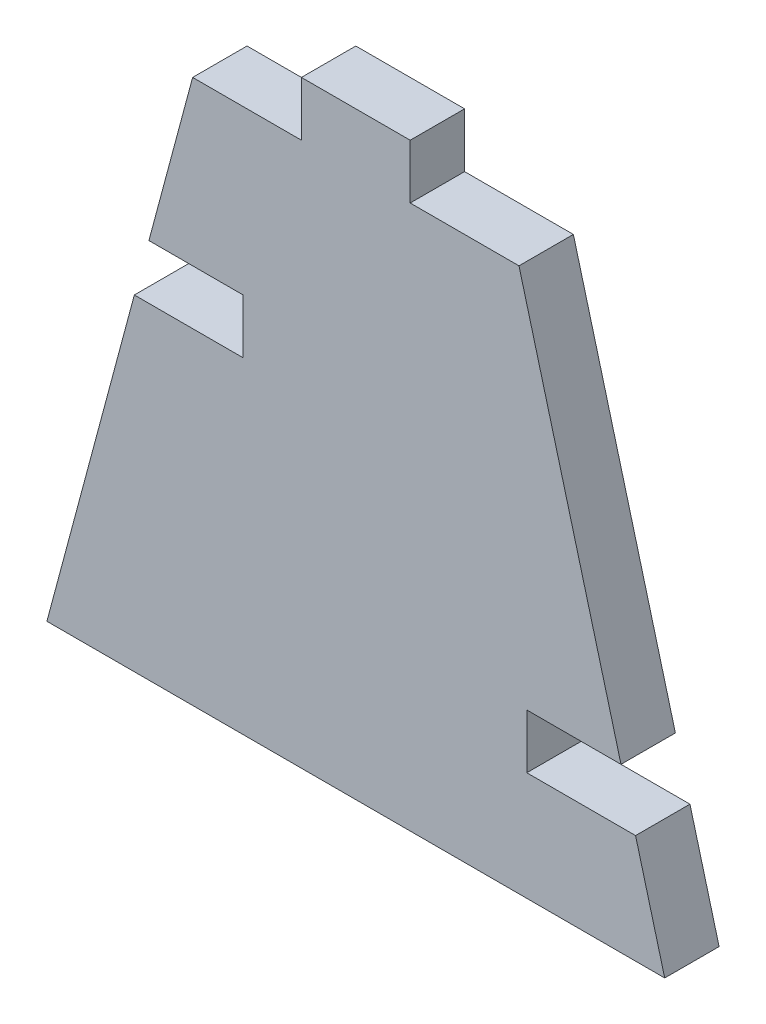
ISO-10303-21;
HEADER;
FILE_DESCRIPTION(('STEP AP214'),'2;1');
FILE_NAME('part.step','',(''),(''),'','','');
FILE_SCHEMA(('AUTOMOTIVE_DESIGN { 1 0 10303 214 1 1 1 1 }'));
ENDSEC;
DATA;
#1=APPLICATION_CONTEXT('core data for automotive mechanical design processes');
#2=APPLICATION_PROTOCOL_DEFINITION('international standard','automotive_design',2000,#1);
#3=PRODUCT_CONTEXT('',#1,'mechanical');
#4=PRODUCT('Part','Part','',(#3));
#5=PRODUCT_RELATED_PRODUCT_CATEGORY('part','',(#4));
#6=PRODUCT_DEFINITION_FORMATION('','',#4);
#7=PRODUCT_DEFINITION_CONTEXT('part definition',#1,'design');
#8=PRODUCT_DEFINITION('design','',#6,#7);
#9=PRODUCT_DEFINITION_SHAPE('','',#8);
#10=(LENGTH_UNIT() NAMED_UNIT(*) SI_UNIT(.MILLI.,.METRE.));
#11=(NAMED_UNIT(*) PLANE_ANGLE_UNIT() SI_UNIT($,.RADIAN.));
#12=(NAMED_UNIT(*) SI_UNIT($,.STERADIAN.) SOLID_ANGLE_UNIT());
#13=UNCERTAINTY_MEASURE_WITH_UNIT(LENGTH_MEASURE(1.E-05),#10,'distance_accuracy_value','');
#14=(GEOMETRIC_REPRESENTATION_CONTEXT(3) GLOBAL_UNCERTAINTY_ASSIGNED_CONTEXT((#13)) GLOBAL_UNIT_ASSIGNED_CONTEXT((#10,
#11,#12)) REPRESENTATION_CONTEXT('',''));
#15=CARTESIAN_POINT('',(0.,0.,0.));
#16=DIRECTION('',(0.,0.,1.));
#17=DIRECTION('',(1.,0.,0.));
#18=AXIS2_PLACEMENT_3D('',#15,#16,#17);
#19=CARTESIAN_POINT('',(-8.03847577293381,-30.,10.));
#20=DIRECTION('',(0.965925826289067,-0.258819045102525,0.));
#21=DIRECTION('',(0.258819045102525,0.965925826289067,0.));
#22=AXIS2_PLACEMENT_3D('',#19,#20,#21);
#23=PLANE('',#22);
#24=DIRECTION('',(-0.258819045102525,-0.965925826289067,0.));
#25=VECTOR('',#24,1.);
#26=CARTESIAN_POINT('',(-8.03847577293381,-30.,0.));
#27=LINE('',#26,#25);
#28=CARTESIAN_POINT('',(0.,0.,0.));
#29=VERTEX_POINT('',#28);
#30=CARTESIAN_POINT('',(-8.03847577293381,-30.,0.));
#31=VERTEX_POINT('',#30);
#32=EDGE_CURVE('E188',#29,#31,#27,.T.);
#33=ORIENTED_EDGE('',*,*,#32,.T.);
#34=DIRECTION('',(0.,0.,-1.));
#35=VECTOR('',#34,1.);
#36=CARTESIAN_POINT('',(-8.03847577293381,-30.,10.));
#37=LINE('',#36,#35);
#38=CARTESIAN_POINT('',(-8.03847577293381,-30.,10.));
#39=VERTEX_POINT('',#38);
#40=EDGE_CURVE('E11',#39,#31,#37,.T.);
#41=ORIENTED_EDGE('',*,*,#40,.F.);
#42=DIRECTION('',(-0.258819045102525,-0.965925826289067,0.));
#43=VECTOR('',#42,1.);
#44=CARTESIAN_POINT('',(-8.03847577293381,-30.,10.));
#45=LINE('',#44,#43);
#46=CARTESIAN_POINT('',(0.,0.,10.));
#47=VERTEX_POINT('',#46);
#48=EDGE_CURVE('E234',#47,#39,#45,.T.);
#49=ORIENTED_EDGE('',*,*,#48,.F.);
#50=DIRECTION('',(0.,0.,-1.));
#51=VECTOR('',#50,1.);
#52=CARTESIAN_POINT('',(0.,0.,10.));
#53=LINE('',#52,#51);
#54=EDGE_CURVE('E184',#47,#29,#53,.T.);
#55=ORIENTED_EDGE('',*,*,#54,.T.);
#56=EDGE_LOOP('',(#33,#41,#49,#55));
#57=FACE_BOUND('',#56,.T.);
#58=ADVANCED_FACE('F39',(#57),#23,.F.);
#59=CARTESIAN_POINT('',(9.28203230275491,-30.,10.));
#60=DIRECTION('',(0.,1.,0.));
#61=DIRECTION('',(-1.,0.,0.));
#62=AXIS2_PLACEMENT_3D('',#59,#60,#61);
#63=PLANE('',#62);
#64=DIRECTION('',(1.,0.,0.));
#65=VECTOR('',#64,1.);
#66=CARTESIAN_POINT('',(9.28203230275491,-30.,0.));
#67=LINE('',#66,#65);
#68=CARTESIAN_POINT('',(9.28203230275491,-30.,0.));
#69=VERTEX_POINT('',#68);
#70=EDGE_CURVE('E192',#31,#69,#67,.T.);
#71=ORIENTED_EDGE('',*,*,#70,.T.);
#72=DIRECTION('',(0.,0.,-1.));
#73=VECTOR('',#72,1.);
#74=CARTESIAN_POINT('',(9.28203230275491,-30.,10.));
#75=LINE('',#74,#73);
#76=CARTESIAN_POINT('',(9.28203230275491,-30.,10.));
#77=VERTEX_POINT('',#76);
#78=EDGE_CURVE('E48',#77,#69,#75,.T.);
#79=ORIENTED_EDGE('',*,*,#78,.F.);
#80=DIRECTION('',(1.,0.,0.));
#81=VECTOR('',#80,1.);
#82=CARTESIAN_POINT('',(9.28203230275491,-30.,10.));
#83=LINE('',#82,#81);
#84=EDGE_CURVE('E123',#39,#77,#83,.T.);
#85=ORIENTED_EDGE('',*,*,#84,.F.);
#86=ORIENTED_EDGE('',*,*,#40,.T.);
#87=EDGE_LOOP('',(#71,#79,#85,#86));
#88=FACE_BOUND('',#87,.T.);
#89=ADVANCED_FACE('F356',(#88),#63,.F.);
#90=CARTESIAN_POINT('',(9.28203230275491,-40.,10.));
#91=DIRECTION('',(1.,0.,0.));
#92=DIRECTION('',(0.,0.,-1.));
#93=AXIS2_PLACEMENT_3D('',#90,#91,#92);
#94=PLANE('',#93);
#95=DIRECTION('',(0.,-1.,0.));
#96=VECTOR('',#95,1.);
#97=CARTESIAN_POINT('',(9.28203230275491,-40.,0.));
#98=LINE('',#97,#96);
#99=CARTESIAN_POINT('',(9.28203230275491,-40.,0.));
#100=VERTEX_POINT('',#99);
#101=EDGE_CURVE('E195',#69,#100,#98,.T.);
#102=ORIENTED_EDGE('',*,*,#101,.T.);
#103=DIRECTION('',(0.,0.,-1.));
#104=VECTOR('',#103,1.);
#105=CARTESIAN_POINT('',(9.28203230275491,-40.,10.));
#106=LINE('',#105,#104);
#107=CARTESIAN_POINT('',(9.28203230275491,-40.,10.));
#108=VERTEX_POINT('',#107);
#109=EDGE_CURVE('E277',#108,#100,#106,.T.);
#110=ORIENTED_EDGE('',*,*,#109,.F.);
#111=DIRECTION('',(0.,-1.,0.));
#112=VECTOR('',#111,1.);
#113=CARTESIAN_POINT('',(9.28203230275491,-40.,10.));
#114=LINE('',#113,#112);
#115=EDGE_CURVE('E287',#77,#108,#114,.T.);
#116=ORIENTED_EDGE('',*,*,#115,.F.);
#117=ORIENTED_EDGE('',*,*,#78,.T.);
#118=EDGE_LOOP('',(#102,#110,#116,#117));
#119=FACE_BOUND('',#118,.T.);
#120=ADVANCED_FACE('F285',(#119),#94,.F.);
#121=CARTESIAN_POINT('',(-10.7179676972451,-40.,10.));
#122=DIRECTION('',(0.,-1.,0.));
#123=DIRECTION('',(0.,0.,-1.));
#124=AXIS2_PLACEMENT_3D('',#121,#122,#123);
#125=PLANE('',#124);
#126=DIRECTION('',(-1.,0.,0.));
#127=VECTOR('',#126,1.);
#128=CARTESIAN_POINT('',(-10.7179676972451,-40.,0.));
#129=LINE('',#128,#127);
#130=CARTESIAN_POINT('',(-10.7179676972451,-40.,0.));
#131=VERTEX_POINT('',#130);
#132=EDGE_CURVE('E198',#100,#131,#129,.T.);
#133=ORIENTED_EDGE('',*,*,#132,.T.);
#134=DIRECTION('',(0.,0.,-1.));
#135=VECTOR('',#134,1.);
#136=CARTESIAN_POINT('',(-10.7179676972451,-40.,10.));
#137=LINE('',#136,#135);
#138=CARTESIAN_POINT('',(-10.7179676972451,-40.,10.));
#139=VERTEX_POINT('',#138);
#140=EDGE_CURVE('E273',#139,#131,#137,.T.);
#141=ORIENTED_EDGE('',*,*,#140,.F.);
#142=DIRECTION('',(-1.,0.,0.));
#143=VECTOR('',#142,1.);
#144=CARTESIAN_POINT('',(-10.7179676972451,-40.,10.));
#145=LINE('',#144,#143);
#146=EDGE_CURVE('E306',#108,#139,#145,.T.);
#147=ORIENTED_EDGE('',*,*,#146,.F.);
#148=ORIENTED_EDGE('',*,*,#109,.T.);
#149=EDGE_LOOP('',(#133,#141,#147,#148));
#150=FACE_BOUND('',#149,.T.);
#151=ADVANCED_FACE('F296',(#150),#125,.F.);
#152=CARTESIAN_POINT('',(-26.7949192431127,-100.,10.));
#153=DIRECTION('',(0.965925826289067,-0.258819045102525,0.));
#154=DIRECTION('',(0.258819045102525,0.965925826289067,0.));
#155=AXIS2_PLACEMENT_3D('',#152,#153,#154);
#156=PLANE('',#155);
#157=DIRECTION('',(-0.258819045102525,-0.965925826289067,0.));
#158=VECTOR('',#157,1.);
#159=CARTESIAN_POINT('',(-26.7949192431127,-100.,0.));
#160=LINE('',#159,#158);
#161=CARTESIAN_POINT('',(-26.7949192431127,-100.,0.));
#162=VERTEX_POINT('',#161);
#163=EDGE_CURVE('E201',#131,#162,#160,.T.);
#164=ORIENTED_EDGE('',*,*,#163,.T.);
#165=DIRECTION('',(0.,0.,-1.));
#166=VECTOR('',#165,1.);
#167=CARTESIAN_POINT('',(-26.7949192431127,-100.,10.));
#168=LINE('',#167,#166);
#169=CARTESIAN_POINT('',(-26.7949192431127,-100.,10.));
#170=VERTEX_POINT('',#169);
#171=EDGE_CURVE('E269',#170,#162,#168,.T.);
#172=ORIENTED_EDGE('',*,*,#171,.F.);
#173=DIRECTION('',(-0.258819045102525,-0.965925826289067,0.));
#174=VECTOR('',#173,1.);
#175=CARTESIAN_POINT('',(-26.7949192431127,-100.,10.));
#176=LINE('',#175,#174);
#177=EDGE_CURVE('E302',#139,#170,#176,.T.);
#178=ORIENTED_EDGE('',*,*,#177,.F.);
#179=ORIENTED_EDGE('',*,*,#140,.T.);
#180=EDGE_LOOP('',(#164,#172,#178,#179));
#181=FACE_BOUND('',#180,.T.);
#182=ADVANCED_FACE('F300',(#181),#156,.F.);
#183=CARTESIAN_POINT('',(86.7949192431127,-100.,10.));
#184=DIRECTION('',(0.,1.,0.));
#185=DIRECTION('',(-1.,0.,0.));
#186=AXIS2_PLACEMENT_3D('',#183,#184,#185);
#187=PLANE('',#186);
#188=DIRECTION('',(1.,0.,0.));
#189=VECTOR('',#188,1.);
#190=CARTESIAN_POINT('',(86.7949192431127,-100.,0.));
#191=LINE('',#190,#189);
#192=CARTESIAN_POINT('',(86.7949192431127,-100.,0.));
#193=VERTEX_POINT('',#192);
#194=EDGE_CURVE('E204',#162,#193,#191,.T.);
#195=ORIENTED_EDGE('',*,*,#194,.T.);
#196=DIRECTION('',(0.,0.,-1.));
#197=VECTOR('',#196,1.);
#198=CARTESIAN_POINT('',(86.7949192431127,-100.,10.));
#199=LINE('',#198,#197);
#200=CARTESIAN_POINT('',(86.7949192431127,-100.,10.));
#201=VERTEX_POINT('',#200);
#202=EDGE_CURVE('E265',#201,#193,#199,.T.);
#203=ORIENTED_EDGE('',*,*,#202,.F.);
#204=DIRECTION('',(1.,0.,0.));
#205=VECTOR('',#204,1.);
#206=CARTESIAN_POINT('',(86.7949192431127,-100.,10.));
#207=LINE('',#206,#205);
#208=EDGE_CURVE('E305',#170,#201,#207,.T.);
#209=ORIENTED_EDGE('',*,*,#208,.F.);
#210=ORIENTED_EDGE('',*,*,#171,.T.);
#211=EDGE_LOOP('',(#195,#203,#209,#210));
#212=FACE_BOUND('',#211,.T.);
#213=ADVANCED_FACE('F369',(#212),#187,.F.);
#214=CARTESIAN_POINT('',(81.4359353944902,-80.,10.));
#215=DIRECTION('',(-0.965925826289067,-0.258819045102525,0.));
#216=DIRECTION('',(0.258819045102525,-0.965925826289067,0.));
#217=AXIS2_PLACEMENT_3D('',#214,#215,#216);
#218=PLANE('',#217);
#219=DIRECTION('',(-0.258819045102525,0.965925826289067,0.));
#220=VECTOR('',#219,1.);
#221=CARTESIAN_POINT('',(81.4359353944902,-80.,0.));
#222=LINE('',#221,#220);
#223=CARTESIAN_POINT('',(81.4359353944902,-80.,0.));
#224=VERTEX_POINT('',#223);
#225=EDGE_CURVE('E207',#193,#224,#222,.T.);
#226=ORIENTED_EDGE('',*,*,#225,.T.);
#227=DIRECTION('',(0.,0.,-1.));
#228=VECTOR('',#227,1.);
#229=CARTESIAN_POINT('',(81.4359353944902,-80.,10.));
#230=LINE('',#229,#228);
#231=CARTESIAN_POINT('',(81.4359353944902,-80.,10.));
#232=VERTEX_POINT('',#231);
#233=EDGE_CURVE('E261',#232,#224,#230,.T.);
#234=ORIENTED_EDGE('',*,*,#233,.F.);
#235=DIRECTION('',(-0.258819045102525,0.965925826289067,0.));
#236=VECTOR('',#235,1.);
#237=CARTESIAN_POINT('',(81.4359353944902,-80.,10.));
#238=LINE('',#237,#236);
#239=EDGE_CURVE('E310',#201,#232,#238,.T.);
#240=ORIENTED_EDGE('',*,*,#239,.F.);
#241=ORIENTED_EDGE('',*,*,#202,.T.);
#242=EDGE_LOOP('',(#226,#234,#240,#241));
#243=FACE_BOUND('',#242,.T.);
#244=ADVANCED_FACE('F372',(#243),#218,.F.);
#245=CARTESIAN_POINT('',(81.4359353944902,-80.,10.));
#246=DIRECTION('',(0.,-1.,0.));
#247=DIRECTION('',(0.,0.,-1.));
#248=AXIS2_PLACEMENT_3D('',#245,#246,#247);
#249=PLANE('',#248);
#250=DIRECTION('',(-1.,0.,0.));
#251=VECTOR('',#250,1.);
#252=CARTESIAN_POINT('',(81.4359353944902,-80.,0.));
#253=LINE('',#252,#251);
#254=CARTESIAN_POINT('',(61.4359353944902,-80.,0.));
#255=VERTEX_POINT('',#254);
#256=EDGE_CURVE('E210',#224,#255,#253,.T.);
#257=ORIENTED_EDGE('',*,*,#256,.T.);
#258=DIRECTION('',(0.,0.,-1.));
#259=VECTOR('',#258,1.);
#260=CARTESIAN_POINT('',(61.4359353944902,-80.,10.));
#261=LINE('',#260,#259);
#262=CARTESIAN_POINT('',(61.4359353944902,-80.,10.));
#263=VERTEX_POINT('',#262);
#264=EDGE_CURVE('E257',#263,#255,#261,.T.);
#265=ORIENTED_EDGE('',*,*,#264,.F.);
#266=DIRECTION('',(-1.,0.,0.));
#267=VECTOR('',#266,1.);
#268=CARTESIAN_POINT('',(81.4359353944902,-80.,10.));
#269=LINE('',#268,#267);
#270=EDGE_CURVE('E317',#232,#263,#269,.T.);
#271=ORIENTED_EDGE('',*,*,#270,.F.);
#272=ORIENTED_EDGE('',*,*,#233,.T.);
#273=EDGE_LOOP('',(#257,#265,#271,#272));
#274=FACE_BOUND('',#273,.T.);
#275=ADVANCED_FACE('F376',(#274),#249,.F.);
#276=CARTESIAN_POINT('',(61.4359353944902,-80.,10.));
#277=DIRECTION('',(-1.,0.,0.));
#278=DIRECTION('',(0.,0.,1.));
#279=AXIS2_PLACEMENT_3D('',#276,#277,#278);
#280=PLANE('',#279);
#281=DIRECTION('',(0.,1.,0.));
#282=VECTOR('',#281,1.);
#283=CARTESIAN_POINT('',(61.4359353944902,-80.,0.));
#284=LINE('',#283,#282);
#285=CARTESIAN_POINT('',(61.4359353944902,-70.,0.));
#286=VERTEX_POINT('',#285);
#287=EDGE_CURVE('E213',#255,#286,#284,.T.);
#288=ORIENTED_EDGE('',*,*,#287,.T.);
#289=DIRECTION('',(0.,0.,-1.));
#290=VECTOR('',#289,1.);
#291=CARTESIAN_POINT('',(61.4359353944902,-70.,10.));
#292=LINE('',#291,#290);
#293=CARTESIAN_POINT('',(61.4359353944902,-70.,10.));
#294=VERTEX_POINT('',#293);
#295=EDGE_CURVE('E253',#294,#286,#292,.T.);
#296=ORIENTED_EDGE('',*,*,#295,.F.);
#297=DIRECTION('',(0.,1.,0.));
#298=VECTOR('',#297,1.);
#299=CARTESIAN_POINT('',(61.4359353944902,-80.,10.));
#300=LINE('',#299,#298);
#301=EDGE_CURVE('E320',#263,#294,#300,.T.);
#302=ORIENTED_EDGE('',*,*,#301,.F.);
#303=ORIENTED_EDGE('',*,*,#264,.T.);
#304=EDGE_LOOP('',(#288,#296,#302,#303));
#305=FACE_BOUND('',#304,.T.);
#306=ADVANCED_FACE('F380',(#305),#280,.F.);
#307=CARTESIAN_POINT('',(61.4359353944902,-70.,10.));
#308=DIRECTION('',(0.,1.,0.));
#309=DIRECTION('',(0.,0.,1.));
#310=AXIS2_PLACEMENT_3D('',#307,#308,#309);
#311=PLANE('',#310);
#312=DIRECTION('',(1.,0.,0.));
#313=VECTOR('',#312,1.);
#314=CARTESIAN_POINT('',(61.4359353944902,-70.,0.));
#315=LINE('',#314,#313);
#316=CARTESIAN_POINT('',(78.7564434701789,-70.,0.));
#317=VERTEX_POINT('',#316);
#318=EDGE_CURVE('E216',#286,#317,#315,.T.);
#319=ORIENTED_EDGE('',*,*,#318,.T.);
#320=DIRECTION('',(0.,0.,-1.));
#321=VECTOR('',#320,1.);
#322=CARTESIAN_POINT('',(78.7564434701789,-70.,10.));
#323=LINE('',#322,#321);
#324=CARTESIAN_POINT('',(78.7564434701789,-70.,10.));
#325=VERTEX_POINT('',#324);
#326=EDGE_CURVE('E249',#325,#317,#323,.T.);
#327=ORIENTED_EDGE('',*,*,#326,.F.);
#328=DIRECTION('',(1.,0.,0.));
#329=VECTOR('',#328,1.);
#330=CARTESIAN_POINT('',(61.4359353944902,-70.,10.));
#331=LINE('',#330,#329);
#332=EDGE_CURVE('E323',#294,#325,#331,.T.);
#333=ORIENTED_EDGE('',*,*,#332,.F.);
#334=ORIENTED_EDGE('',*,*,#295,.T.);
#335=EDGE_LOOP('',(#319,#327,#333,#334));
#336=FACE_BOUND('',#335,.T.);
#337=ADVANCED_FACE('F384',(#336),#311,.F.);
#338=CARTESIAN_POINT('',(60.,0.,10.));
#339=DIRECTION('',(-0.965925826289067,-0.258819045102525,0.));
#340=DIRECTION('',(0.258819045102525,-0.965925826289067,0.));
#341=AXIS2_PLACEMENT_3D('',#338,#339,#340);
#342=PLANE('',#341);
#343=DIRECTION('',(-0.258819045102525,0.965925826289067,0.));
#344=VECTOR('',#343,1.);
#345=CARTESIAN_POINT('',(60.,0.,0.));
#346=LINE('',#345,#344);
#347=CARTESIAN_POINT('',(60.,0.,0.));
#348=VERTEX_POINT('',#347);
#349=EDGE_CURVE('E219',#317,#348,#346,.T.);
#350=ORIENTED_EDGE('',*,*,#349,.T.);
#351=DIRECTION('',(0.,0.,-1.));
#352=VECTOR('',#351,1.);
#353=CARTESIAN_POINT('',(60.,0.,10.));
#354=LINE('',#353,#352);
#355=CARTESIAN_POINT('',(60.,0.,10.));
#356=VERTEX_POINT('',#355);
#357=EDGE_CURVE('E245',#356,#348,#354,.T.);
#358=ORIENTED_EDGE('',*,*,#357,.F.);
#359=DIRECTION('',(-0.258819045102525,0.965925826289067,0.));
#360=VECTOR('',#359,1.);
#361=CARTESIAN_POINT('',(60.,0.,10.));
#362=LINE('',#361,#360);
#363=EDGE_CURVE('E326',#325,#356,#362,.T.);
#364=ORIENTED_EDGE('',*,*,#363,.F.);
#365=ORIENTED_EDGE('',*,*,#326,.T.);
#366=EDGE_LOOP('',(#350,#358,#364,#365));
#367=FACE_BOUND('',#366,.T.);
#368=ADVANCED_FACE('F388',(#367),#342,.F.);
#369=CARTESIAN_POINT('',(40.,0.,10.));
#370=DIRECTION('',(0.,-1.,0.));
#371=DIRECTION('',(0.,0.,-1.));
#372=AXIS2_PLACEMENT_3D('',#369,#370,#371);
#373=PLANE('',#372);
#374=DIRECTION('',(-1.,0.,0.));
#375=VECTOR('',#374,1.);
#376=CARTESIAN_POINT('',(40.,0.,0.));
#377=LINE('',#376,#375);
#378=CARTESIAN_POINT('',(40.,0.,0.));
#379=VERTEX_POINT('',#378);
#380=EDGE_CURVE('E222',#348,#379,#377,.T.);
#381=ORIENTED_EDGE('',*,*,#380,.T.);
#382=DIRECTION('',(0.,0.,-1.));
#383=VECTOR('',#382,1.);
#384=CARTESIAN_POINT('',(40.,0.,10.));
#385=LINE('',#384,#383);
#386=CARTESIAN_POINT('',(40.,0.,10.));
#387=VERTEX_POINT('',#386);
#388=EDGE_CURVE('E241',#387,#379,#385,.T.);
#389=ORIENTED_EDGE('',*,*,#388,.F.);
#390=DIRECTION('',(-1.,0.,0.));
#391=VECTOR('',#390,1.);
#392=CARTESIAN_POINT('',(40.,0.,10.));
#393=LINE('',#392,#391);
#394=EDGE_CURVE('E329',#356,#387,#393,.T.);
#395=ORIENTED_EDGE('',*,*,#394,.F.);
#396=ORIENTED_EDGE('',*,*,#357,.T.);
#397=EDGE_LOOP('',(#381,#389,#395,#396));
#398=FACE_BOUND('',#397,.T.);
#399=ADVANCED_FACE('F337',(#398),#373,.F.);
#400=CARTESIAN_POINT('',(40.,10.,10.));
#401=DIRECTION('',(-1.,0.,0.));
#402=DIRECTION('',(0.,0.,1.));
#403=AXIS2_PLACEMENT_3D('',#400,#401,#402);
#404=PLANE('',#403);
#405=DIRECTION('',(0.,1.,0.));
#406=VECTOR('',#405,1.);
#407=CARTESIAN_POINT('',(40.,10.,0.));
#408=LINE('',#407,#406);
#409=CARTESIAN_POINT('',(40.,10.,0.));
#410=VERTEX_POINT('',#409);
#411=EDGE_CURVE('E225',#379,#410,#408,.T.);
#412=ORIENTED_EDGE('',*,*,#411,.T.);
#413=DIRECTION('',(0.,0.,-1.));
#414=VECTOR('',#413,1.);
#415=CARTESIAN_POINT('',(40.,10.,10.));
#416=LINE('',#415,#414);
#417=CARTESIAN_POINT('',(40.,10.,10.));
#418=VERTEX_POINT('',#417);
#419=EDGE_CURVE('E177',#418,#410,#416,.T.);
#420=ORIENTED_EDGE('',*,*,#419,.F.);
#421=DIRECTION('',(0.,1.,0.));
#422=VECTOR('',#421,1.);
#423=CARTESIAN_POINT('',(40.,10.,10.));
#424=LINE('',#423,#422);
#425=EDGE_CURVE('E166',#387,#418,#424,.T.);
#426=ORIENTED_EDGE('',*,*,#425,.F.);
#427=ORIENTED_EDGE('',*,*,#388,.T.);
#428=EDGE_LOOP('',(#412,#420,#426,#427));
#429=FACE_BOUND('',#428,.T.);
#430=ADVANCED_FACE('F341',(#429),#404,.F.);
#431=CARTESIAN_POINT('',(20.,10.,10.));
#432=DIRECTION('',(0.,-1.,0.));
#433=DIRECTION('',(0.,0.,-1.));
#434=AXIS2_PLACEMENT_3D('',#431,#432,#433);
#435=PLANE('',#434);
#436=DIRECTION('',(-1.,0.,0.));
#437=VECTOR('',#436,1.);
#438=CARTESIAN_POINT('',(20.,10.,0.));
#439=LINE('',#438,#437);
#440=CARTESIAN_POINT('',(20.,10.,0.));
#441=VERTEX_POINT('',#440);
#442=EDGE_CURVE('E175',#410,#441,#439,.T.);
#443=ORIENTED_EDGE('',*,*,#442,.T.);
#444=DIRECTION('',(0.,0.,-1.));
#445=VECTOR('',#444,1.);
#446=CARTESIAN_POINT('',(20.,10.,10.));
#447=LINE('',#446,#445);
#448=CARTESIAN_POINT('',(20.,10.,10.));
#449=VERTEX_POINT('',#448);
#450=EDGE_CURVE('E172',#449,#441,#447,.T.);
#451=ORIENTED_EDGE('',*,*,#450,.F.);
#452=DIRECTION('',(-1.,0.,0.));
#453=VECTOR('',#452,1.);
#454=CARTESIAN_POINT('',(20.,10.,10.));
#455=LINE('',#454,#453);
#456=EDGE_CURVE('E160',#418,#449,#455,.T.);
#457=ORIENTED_EDGE('',*,*,#456,.F.);
#458=ORIENTED_EDGE('',*,*,#419,.T.);
#459=EDGE_LOOP('',(#443,#451,#457,#458));
#460=FACE_BOUND('',#459,.T.);
#461=ADVANCED_FACE('F173',(#460),#435,.F.);
#462=CARTESIAN_POINT('',(20.,0.,10.));
#463=DIRECTION('',(1.,0.,0.));
#464=DIRECTION('',(0.,0.,-1.));
#465=AXIS2_PLACEMENT_3D('',#462,#463,#464);
#466=PLANE('',#465);
#467=DIRECTION('',(0.,-1.,0.));
#468=VECTOR('',#467,1.);
#469=CARTESIAN_POINT('',(20.,0.,0.));
#470=LINE('',#469,#468);
#471=CARTESIAN_POINT('',(20.,0.,0.));
#472=VERTEX_POINT('',#471);
#473=EDGE_CURVE('E109',#441,#472,#470,.T.);
#474=ORIENTED_EDGE('',*,*,#473,.T.);
#475=DIRECTION('',(0.,0.,-1.));
#476=VECTOR('',#475,1.);
#477=CARTESIAN_POINT('',(20.,0.,10.));
#478=LINE('',#477,#476);
#479=CARTESIAN_POINT('',(20.,0.,10.));
#480=VERTEX_POINT('',#479);
#481=EDGE_CURVE('E178',#480,#472,#478,.T.);
#482=ORIENTED_EDGE('',*,*,#481,.F.);
#483=DIRECTION('',(0.,-1.,0.));
#484=VECTOR('',#483,1.);
#485=CARTESIAN_POINT('',(20.,0.,10.));
#486=LINE('',#485,#484);
#487=EDGE_CURVE('E164',#449,#480,#486,.T.);
#488=ORIENTED_EDGE('',*,*,#487,.F.);
#489=ORIENTED_EDGE('',*,*,#450,.T.);
#490=EDGE_LOOP('',(#474,#482,#488,#489));
#491=FACE_BOUND('',#490,.T.);
#492=ADVANCED_FACE('F180',(#491),#466,.F.);
#493=CARTESIAN_POINT('',(0.,0.,10.));
#494=DIRECTION('',(0.,-1.,0.));
#495=DIRECTION('',(0.,0.,-1.));
#496=AXIS2_PLACEMENT_3D('',#493,#494,#495);
#497=PLANE('',#496);
#498=DIRECTION('',(-1.,0.,0.));
#499=VECTOR('',#498,1.);
#500=CARTESIAN_POINT('',(0.,0.,0.));
#501=LINE('',#500,#499);
#502=EDGE_CURVE('E115',#472,#29,#501,.T.);
#503=ORIENTED_EDGE('',*,*,#502,.T.);
#504=ORIENTED_EDGE('',*,*,#54,.F.);
#505=DIRECTION('',(-1.,0.,0.));
#506=VECTOR('',#505,1.);
#507=CARTESIAN_POINT('',(0.,0.,10.));
#508=LINE('',#507,#506);
#509=EDGE_CURVE('E56',#480,#47,#508,.T.);
#510=ORIENTED_EDGE('',*,*,#509,.F.);
#511=ORIENTED_EDGE('',*,*,#481,.T.);
#512=EDGE_LOOP('',(#503,#504,#510,#511));
#513=FACE_BOUND('',#512,.T.);
#514=ADVANCED_FACE('F345',(#513),#497,.F.);
#515=CARTESIAN_POINT('',(0.,0.,10.));
#516=DIRECTION('',(0.,0.,-1.));
#517=DIRECTION('',(-1.,0.,0.));
#518=AXIS2_PLACEMENT_3D('',#515,#516,#517);
#519=PLANE('',#518);
#520=ORIENTED_EDGE('',*,*,#48,.T.);
#521=ORIENTED_EDGE('',*,*,#84,.T.);
#522=ORIENTED_EDGE('',*,*,#115,.T.);
#523=ORIENTED_EDGE('',*,*,#146,.T.);
#524=ORIENTED_EDGE('',*,*,#177,.T.);
#525=ORIENTED_EDGE('',*,*,#208,.T.);
#526=ORIENTED_EDGE('',*,*,#239,.T.);
#527=ORIENTED_EDGE('',*,*,#270,.T.);
#528=ORIENTED_EDGE('',*,*,#301,.T.);
#529=ORIENTED_EDGE('',*,*,#332,.T.);
#530=ORIENTED_EDGE('',*,*,#363,.T.);
#531=ORIENTED_EDGE('',*,*,#394,.T.);
#532=ORIENTED_EDGE('',*,*,#425,.T.);
#533=ORIENTED_EDGE('',*,*,#456,.T.);
#534=ORIENTED_EDGE('',*,*,#487,.T.);
#535=ORIENTED_EDGE('',*,*,#509,.T.);
#536=EDGE_LOOP('',(#520,#521,#522,#523,#524,#525,#526,#527,#528,#529,#530,#531,#532,#533,#534,#535));
#537=FACE_BOUND('',#536,.T.);
#538=ADVANCED_FACE('F162',(#537),#519,.F.);
#539=CARTESIAN_POINT('',(0.,0.,0.));
#540=DIRECTION('',(0.,0.,-1.));
#541=DIRECTION('',(-1.,0.,0.));
#542=AXIS2_PLACEMENT_3D('',#539,#540,#541);
#543=PLANE('',#542);
#544=ORIENTED_EDGE('',*,*,#32,.F.);
#545=ORIENTED_EDGE('',*,*,#502,.F.);
#546=ORIENTED_EDGE('',*,*,#473,.F.);
#547=ORIENTED_EDGE('',*,*,#442,.F.);
#548=ORIENTED_EDGE('',*,*,#411,.F.);
#549=ORIENTED_EDGE('',*,*,#380,.F.);
#550=ORIENTED_EDGE('',*,*,#349,.F.);
#551=ORIENTED_EDGE('',*,*,#318,.F.);
#552=ORIENTED_EDGE('',*,*,#287,.F.);
#553=ORIENTED_EDGE('',*,*,#256,.F.);
#554=ORIENTED_EDGE('',*,*,#225,.F.);
#555=ORIENTED_EDGE('',*,*,#194,.F.);
#556=ORIENTED_EDGE('',*,*,#163,.F.);
#557=ORIENTED_EDGE('',*,*,#132,.F.);
#558=ORIENTED_EDGE('',*,*,#101,.F.);
#559=ORIENTED_EDGE('',*,*,#70,.F.);
#560=EDGE_LOOP('',(#544,#545,#546,#547,#548,#549,#550,#551,#552,#553,#554,#555,#556,#557,#558,#559));
#561=FACE_BOUND('',#560,.T.);
#562=ADVANCED_FACE('F291',(#561),#543,.T.);
#563=CLOSED_SHELL('',(#58,#89,#120,#151,#182,#213,#244,#275,#306,#337,#368,#399,#430,#461,#492,
#514,#538,#562));
#564=MANIFOLD_SOLID_BREP('B2',#563);
#565=ADVANCED_BREP_SHAPE_REPRESENTATION('',(#18,#564),#14);
#566=SHAPE_DEFINITION_REPRESENTATION(#9,#565);
ENDSEC;
END-ISO-10303-21;
